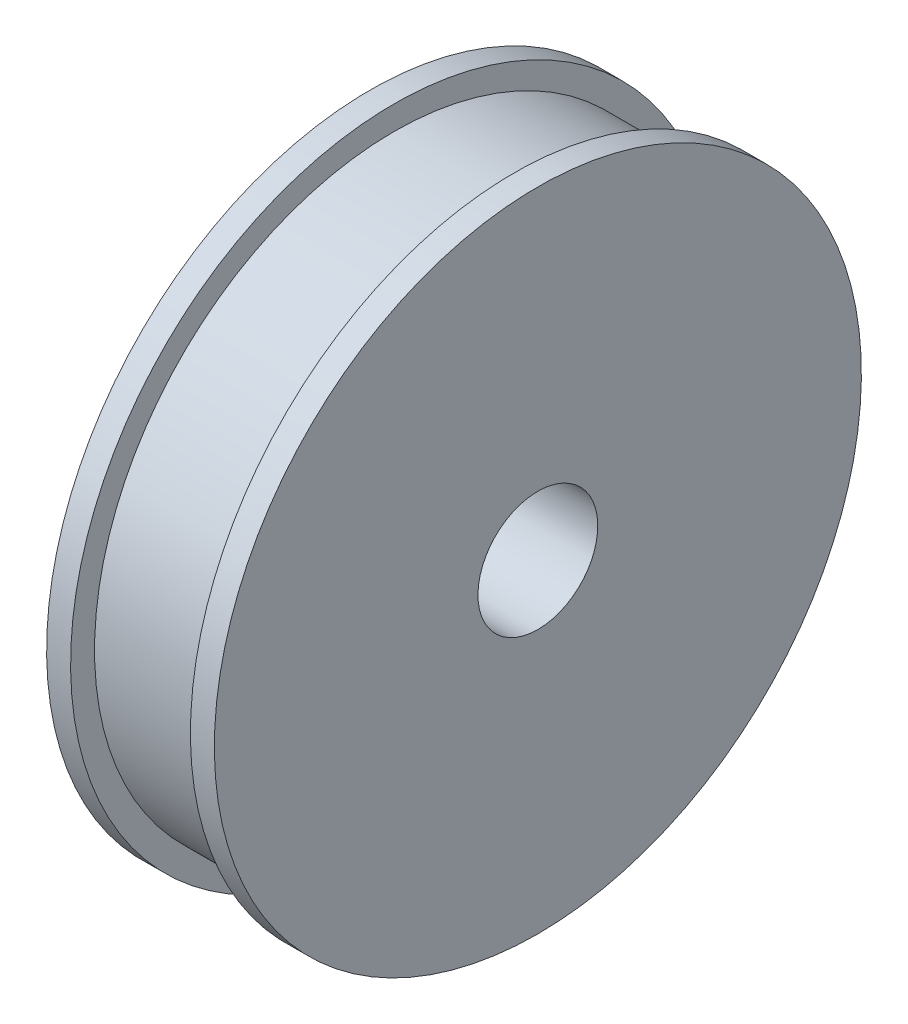
ISO-10303-21;
HEADER;
FILE_DESCRIPTION(('STEP AP214'),'2;1');
FILE_NAME('part.step','',(''),(''),'','','');
FILE_SCHEMA(('AUTOMOTIVE_DESIGN { 1 0 10303 214 1 1 1 1 }'));
ENDSEC;
DATA;
#1=APPLICATION_CONTEXT('core data for automotive mechanical design processes');
#2=APPLICATION_PROTOCOL_DEFINITION('international standard','automotive_design',2000,#1);
#3=PRODUCT_CONTEXT('',#1,'mechanical');
#4=PRODUCT('Part','Part','',(#3));
#5=PRODUCT_RELATED_PRODUCT_CATEGORY('part','',(#4));
#6=PRODUCT_DEFINITION_FORMATION('','',#4);
#7=PRODUCT_DEFINITION_CONTEXT('part definition',#1,'design');
#8=PRODUCT_DEFINITION('design','',#6,#7);
#9=PRODUCT_DEFINITION_SHAPE('','',#8);
#10=(LENGTH_UNIT() NAMED_UNIT(*) SI_UNIT(.MILLI.,.METRE.));
#11=(NAMED_UNIT(*) PLANE_ANGLE_UNIT() SI_UNIT($,.RADIAN.));
#12=(NAMED_UNIT(*) SI_UNIT($,.STERADIAN.) SOLID_ANGLE_UNIT());
#13=UNCERTAINTY_MEASURE_WITH_UNIT(LENGTH_MEASURE(1.E-05),#10,'distance_accuracy_value','');
#14=(GEOMETRIC_REPRESENTATION_CONTEXT(3) GLOBAL_UNCERTAINTY_ASSIGNED_CONTEXT((#13)) GLOBAL_UNIT_ASSIGNED_CONTEXT((#10,
#11,#12)) REPRESENTATION_CONTEXT('',''));
#15=CARTESIAN_POINT('',(0.,0.,0.));
#16=DIRECTION('',(0.,0.,1.));
#17=DIRECTION('',(1.,0.,0.));
#18=AXIS2_PLACEMENT_3D('',#15,#16,#17);
#19=CARTESIAN_POINT('',(-7.,0.,0.));
#20=DIRECTION('',(-1.,0.,0.));
#21=DIRECTION('',(0.,-1.,0.));
#22=AXIS2_PLACEMENT_3D('',#19,#20,#21);
#23=CYLINDRICAL_SURFACE('',#22,27.);
#24=CARTESIAN_POINT('',(5.00000000000001,0.,0.));
#25=DIRECTION('',(-1.,0.,0.));
#26=DIRECTION('',(0.,-1.,0.));
#27=AXIS2_PLACEMENT_3D('',#24,#25,#26);
#28=CIRCLE('',#27,27.);
#29=CARTESIAN_POINT('',(5.00000000000001,-27.,0.));
#30=VERTEX_POINT('',#29);
#31=EDGE_CURVE('E10',#30,#30,#28,.T.);
#32=ORIENTED_EDGE('',*,*,#31,.F.);
#33=EDGE_LOOP('',(#32));
#34=FACE_BOUND('',#33,.T.);
#35=CARTESIAN_POINT('',(7.00000000000001,0.,0.));
#36=DIRECTION('',(-1.,0.,0.));
#37=DIRECTION('',(0.,-1.,0.));
#38=AXIS2_PLACEMENT_3D('',#35,#36,#37);
#39=CIRCLE('',#38,27.);
#40=CARTESIAN_POINT('',(7.00000000000001,-27.,0.));
#41=VERTEX_POINT('',#40);
#42=EDGE_CURVE('E62',#41,#41,#39,.T.);
#43=ORIENTED_EDGE('',*,*,#42,.T.);
#44=EDGE_LOOP('',(#43));
#45=FACE_BOUND('',#44,.T.);
#46=ADVANCED_FACE('F34',(#34,#45),#23,.T.);
#47=CARTESIAN_POINT('',(5.,27.,0.));
#48=DIRECTION('',(1.,0.,0.));
#49=DIRECTION('',(0.,1.,0.));
#50=AXIS2_PLACEMENT_3D('',#47,#48,#49);
#51=PLANE('',#50);
#52=CARTESIAN_POINT('',(5.,0.,0.));
#53=DIRECTION('',(-1.,0.,0.));
#54=DIRECTION('',(0.,-1.,0.));
#55=AXIS2_PLACEMENT_3D('',#52,#53,#54);
#56=CIRCLE('',#55,25.);
#57=CARTESIAN_POINT('',(5.00000000000001,-25.,0.));
#58=VERTEX_POINT('',#57);
#59=EDGE_CURVE('E40',#58,#58,#56,.T.);
#60=ORIENTED_EDGE('',*,*,#59,.F.);
#61=EDGE_LOOP('',(#60));
#62=FACE_BOUND('',#61,.T.);
#63=ORIENTED_EDGE('',*,*,#31,.T.);
#64=EDGE_LOOP('',(#63));
#65=FACE_BOUND('',#64,.T.);
#66=ADVANCED_FACE('F99',(#62,#65),#51,.F.);
#67=CARTESIAN_POINT('',(-7.,0.,0.));
#68=DIRECTION('',(-1.,0.,0.));
#69=DIRECTION('',(0.,-1.,0.));
#70=AXIS2_PLACEMENT_3D('',#67,#68,#69);
#71=CYLINDRICAL_SURFACE('',#70,25.);
#72=CARTESIAN_POINT('',(-5.,0.,0.));
#73=DIRECTION('',(-1.,0.,0.));
#74=DIRECTION('',(0.,-1.,0.));
#75=AXIS2_PLACEMENT_3D('',#72,#73,#74);
#76=CIRCLE('',#75,25.);
#77=CARTESIAN_POINT('',(-4.99999999999999,-25.,0.));
#78=VERTEX_POINT('',#77);
#79=EDGE_CURVE('E44',#78,#78,#76,.T.);
#80=ORIENTED_EDGE('',*,*,#79,.F.);
#81=EDGE_LOOP('',(#80));
#82=FACE_BOUND('',#81,.T.);
#83=ORIENTED_EDGE('',*,*,#59,.T.);
#84=EDGE_LOOP('',(#83));
#85=FACE_BOUND('',#84,.T.);
#86=ADVANCED_FACE('F94',(#82,#85),#71,.T.);
#87=CARTESIAN_POINT('',(-5.,25.,0.));
#88=DIRECTION('',(-1.,0.,0.));
#89=DIRECTION('',(0.,-1.,0.));
#90=AXIS2_PLACEMENT_3D('',#87,#88,#89);
#91=PLANE('',#90);
#92=CARTESIAN_POINT('',(-5.,0.,0.));
#93=DIRECTION('',(-1.,0.,0.));
#94=DIRECTION('',(0.,-1.,0.));
#95=AXIS2_PLACEMENT_3D('',#92,#93,#94);
#96=CIRCLE('',#95,27.);
#97=CARTESIAN_POINT('',(-4.99999999999999,-27.,0.));
#98=VERTEX_POINT('',#97);
#99=EDGE_CURVE('E48',#98,#98,#96,.T.);
#100=ORIENTED_EDGE('',*,*,#99,.F.);
#101=EDGE_LOOP('',(#100));
#102=FACE_BOUND('',#101,.T.);
#103=ORIENTED_EDGE('',*,*,#79,.T.);
#104=EDGE_LOOP('',(#103));
#105=FACE_BOUND('',#104,.T.);
#106=ADVANCED_FACE('F88',(#102,#105),#91,.F.);
#107=CARTESIAN_POINT('',(-7.,0.,0.));
#108=DIRECTION('',(-1.,0.,0.));
#109=DIRECTION('',(0.,-1.,0.));
#110=AXIS2_PLACEMENT_3D('',#107,#108,#109);
#111=CYLINDRICAL_SURFACE('',#110,27.);
#112=CARTESIAN_POINT('',(-7.,0.,0.));
#113=DIRECTION('',(-1.,0.,0.));
#114=DIRECTION('',(0.,-1.,0.));
#115=AXIS2_PLACEMENT_3D('',#112,#113,#114);
#116=CIRCLE('',#115,27.);
#117=CARTESIAN_POINT('',(-6.99999999999999,-27.,0.));
#118=VERTEX_POINT('',#117);
#119=EDGE_CURVE('E53',#118,#118,#116,.T.);
#120=ORIENTED_EDGE('',*,*,#119,.F.);
#121=EDGE_LOOP('',(#120));
#122=FACE_BOUND('',#121,.T.);
#123=ORIENTED_EDGE('',*,*,#99,.T.);
#124=EDGE_LOOP('',(#123));
#125=FACE_BOUND('',#124,.T.);
#126=ADVANCED_FACE('F82',(#122,#125),#111,.T.);
#127=CARTESIAN_POINT('',(-7.,27.,0.));
#128=DIRECTION('',(1.,0.,0.));
#129=DIRECTION('',(0.,1.,0.));
#130=AXIS2_PLACEMENT_3D('',#127,#128,#129);
#131=PLANE('',#130);
#132=CARTESIAN_POINT('',(-7.,0.,0.));
#133=DIRECTION('',(-1.,0.,0.));
#134=DIRECTION('',(0.,-1.,0.));
#135=AXIS2_PLACEMENT_3D('',#132,#133,#134);
#136=CIRCLE('',#135,5.);
#137=CARTESIAN_POINT('',(-7.,-5.,0.));
#138=VERTEX_POINT('',#137);
#139=EDGE_CURVE('E56',#138,#138,#136,.T.);
#140=ORIENTED_EDGE('',*,*,#139,.F.);
#141=EDGE_LOOP('',(#140));
#142=FACE_BOUND('',#141,.T.);
#143=ORIENTED_EDGE('',*,*,#119,.T.);
#144=EDGE_LOOP('',(#143));
#145=FACE_BOUND('',#144,.T.);
#146=ADVANCED_FACE('F76',(#142,#145),#131,.F.);
#147=CARTESIAN_POINT('',(-7.,0.,0.));
#148=DIRECTION('',(-1.,0.,0.));
#149=DIRECTION('',(0.,-1.,0.));
#150=AXIS2_PLACEMENT_3D('',#147,#148,#149);
#151=CYLINDRICAL_SURFACE('',#150,5.);
#152=CARTESIAN_POINT('',(7.,0.,0.));
#153=DIRECTION('',(-1.,0.,0.));
#154=DIRECTION('',(0.,-1.,0.));
#155=AXIS2_PLACEMENT_3D('',#152,#153,#154);
#156=CIRCLE('',#155,4.99999999999999);
#157=CARTESIAN_POINT('',(7.,-4.99999999999999,0.));
#158=VERTEX_POINT('',#157);
#159=EDGE_CURVE('E59',#158,#158,#156,.T.);
#160=ORIENTED_EDGE('',*,*,#159,.F.);
#161=EDGE_LOOP('',(#160));
#162=FACE_BOUND('',#161,.T.);
#163=ORIENTED_EDGE('',*,*,#139,.T.);
#164=EDGE_LOOP('',(#163));
#165=FACE_BOUND('',#164,.T.);
#166=ADVANCED_FACE('F70',(#162,#165),#151,.F.);
#167=CARTESIAN_POINT('',(7.,5.,0.));
#168=DIRECTION('',(-1.,0.,0.));
#169=DIRECTION('',(0.,-1.,0.));
#170=AXIS2_PLACEMENT_3D('',#167,#168,#169);
#171=PLANE('',#170);
#172=ORIENTED_EDGE('',*,*,#42,.F.);
#173=EDGE_LOOP('',(#172));
#174=FACE_BOUND('',#173,.T.);
#175=ORIENTED_EDGE('',*,*,#159,.T.);
#176=EDGE_LOOP('',(#175));
#177=FACE_BOUND('',#176,.T.);
#178=ADVANCED_FACE('F67',(#174,#177),#171,.F.);
#179=CLOSED_SHELL('',(#46,#66,#86,#106,#126,#146,#166,#178));
#180=MANIFOLD_SOLID_BREP('B2',#179);
#181=ADVANCED_BREP_SHAPE_REPRESENTATION('',(#18,#180),#14);
#182=SHAPE_DEFINITION_REPRESENTATION(#9,#181);
ENDSEC;
END-ISO-10303-21;
